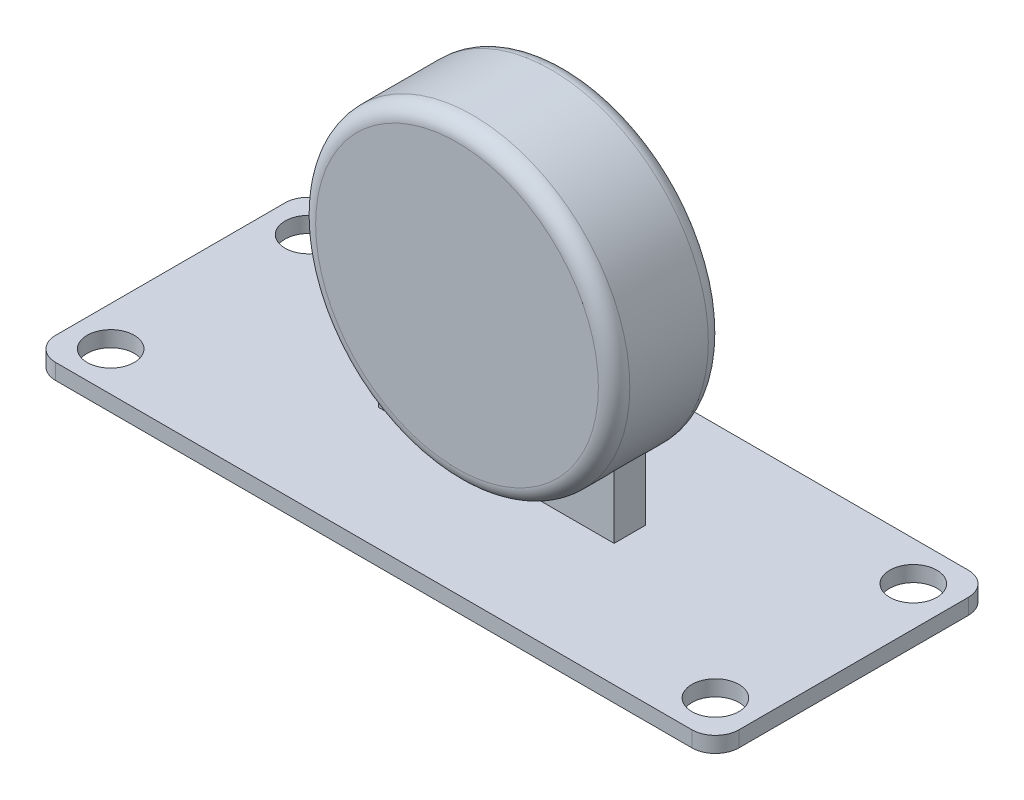
ISO-10303-21;
HEADER;
FILE_DESCRIPTION(('STEP AP214'),'2;1');
FILE_NAME('part.step','',(''),(''),'','','');
FILE_SCHEMA(('AUTOMOTIVE_DESIGN { 1 0 10303 214 1 1 1 1 }'));
ENDSEC;
DATA;
#1=APPLICATION_CONTEXT('core data for automotive mechanical design processes');
#2=APPLICATION_PROTOCOL_DEFINITION('international standard','automotive_design',2000,#1);
#3=PRODUCT_CONTEXT('',#1,'mechanical');
#4=PRODUCT('Part','Part','',(#3));
#5=PRODUCT_RELATED_PRODUCT_CATEGORY('part','',(#4));
#6=PRODUCT_DEFINITION_FORMATION('','',#4);
#7=PRODUCT_DEFINITION_CONTEXT('part definition',#1,'design');
#8=PRODUCT_DEFINITION('design','',#6,#7);
#9=PRODUCT_DEFINITION_SHAPE('','',#8);
#10=(LENGTH_UNIT() NAMED_UNIT(*) SI_UNIT(.MILLI.,.METRE.));
#11=(NAMED_UNIT(*) PLANE_ANGLE_UNIT() SI_UNIT($,.RADIAN.));
#12=(NAMED_UNIT(*) SI_UNIT($,.STERADIAN.) SOLID_ANGLE_UNIT());
#13=UNCERTAINTY_MEASURE_WITH_UNIT(LENGTH_MEASURE(1.E-05),#10,'distance_accuracy_value','');
#14=(GEOMETRIC_REPRESENTATION_CONTEXT(3) GLOBAL_UNCERTAINTY_ASSIGNED_CONTEXT((#13)) GLOBAL_UNIT_ASSIGNED_CONTEXT((#10,
#11,#12)) REPRESENTATION_CONTEXT('',''));
#15=CARTESIAN_POINT('',(0.,0.,0.));
#16=DIRECTION('',(0.,0.,1.));
#17=DIRECTION('',(1.,0.,0.));
#18=AXIS2_PLACEMENT_3D('',#15,#16,#17);
#19=CARTESIAN_POINT('',(-514.35,25.4,185.42));
#20=DIRECTION('',(0.,-1.,0.));
#21=DIRECTION('',(0.,0.,-1.));
#22=AXIS2_PLACEMENT_3D('',#19,#20,#21);
#23=PLANE('',#22);
#24=CARTESIAN_POINT('',(-488.95,25.4,160.02));
#25=DIRECTION('',(0.,1.,0.));
#26=DIRECTION('',(0.,0.,1.));
#27=AXIS2_PLACEMENT_3D('',#24,#25,#26);
#28=CIRCLE('',#27,38.1);
#29=CARTESIAN_POINT('',(-488.95,25.4,198.12));
#30=VERTEX_POINT('',#29);
#31=EDGE_CURVE('E244',#30,#30,#28,.T.);
#32=ORIENTED_EDGE('',*,*,#31,.F.);
#33=EDGE_LOOP('',(#32));
#34=FACE_BOUND('',#33,.T.);
#35=CARTESIAN_POINT('',(488.95,25.4,160.02));
#36=DIRECTION('',(0.,1.,0.));
#37=DIRECTION('',(0.,0.,1.));
#38=AXIS2_PLACEMENT_3D('',#35,#36,#37);
#39=CIRCLE('',#38,38.1);
#40=CARTESIAN_POINT('',(488.95,25.4,198.12));
#41=VERTEX_POINT('',#40);
#42=EDGE_CURVE('E250',#41,#41,#39,.T.);
#43=ORIENTED_EDGE('',*,*,#42,.F.);
#44=EDGE_LOOP('',(#43));
#45=FACE_BOUND('',#44,.T.);
#46=CARTESIAN_POINT('',(488.95,25.4,-160.02));
#47=DIRECTION('',(0.,1.,0.));
#48=DIRECTION('',(0.,0.,1.));
#49=AXIS2_PLACEMENT_3D('',#46,#47,#48);
#50=CIRCLE('',#49,38.1000000000001);
#51=CARTESIAN_POINT('',(488.95,25.4,-121.92));
#52=VERTEX_POINT('',#51);
#53=EDGE_CURVE('E256',#52,#52,#50,.T.);
#54=ORIENTED_EDGE('',*,*,#53,.F.);
#55=EDGE_LOOP('',(#54));
#56=FACE_BOUND('',#55,.T.);
#57=CARTESIAN_POINT('',(-488.95,25.4,-160.02));
#58=DIRECTION('',(0.,1.,0.));
#59=DIRECTION('',(0.,0.,1.));
#60=AXIS2_PLACEMENT_3D('',#57,#58,#59);
#61=CIRCLE('',#60,38.1);
#62=CARTESIAN_POINT('',(-488.95,25.4,-121.92));
#63=VERTEX_POINT('',#62);
#64=EDGE_CURVE('E147',#63,#63,#61,.T.);
#65=ORIENTED_EDGE('',*,*,#64,.F.);
#66=EDGE_LOOP('',(#65));
#67=FACE_BOUND('',#66,.T.);
#68=CARTESIAN_POINT('',(-514.35,25.4,185.42));
#69=DIRECTION('',(0.,1.,0.));
#70=DIRECTION('',(0.,0.,-1.));
#71=AXIS2_PLACEMENT_3D('',#68,#69,#70);
#72=CIRCLE('',#71,38.1);
#73=CARTESIAN_POINT('',(-552.45,25.4,185.42));
#74=VERTEX_POINT('',#73);
#75=CARTESIAN_POINT('',(-514.35,25.4,223.52));
#76=VERTEX_POINT('',#75);
#77=EDGE_CURVE('E159',#74,#76,#72,.T.);
#78=ORIENTED_EDGE('',*,*,#77,.T.);
#79=DIRECTION('',(1.,0.,0.));
#80=VECTOR('',#79,1.);
#81=CARTESIAN_POINT('',(-514.35,25.4,223.52));
#82=LINE('',#81,#80);
#83=CARTESIAN_POINT('',(514.35,25.4,223.52));
#84=VERTEX_POINT('',#83);
#85=EDGE_CURVE('E100',#76,#84,#82,.T.);
#86=ORIENTED_EDGE('',*,*,#85,.T.);
#87=CARTESIAN_POINT('',(514.35,25.4,185.42));
#88=DIRECTION('',(0.,1.,0.));
#89=DIRECTION('',(0.,0.,-1.));
#90=AXIS2_PLACEMENT_3D('',#87,#88,#89);
#91=CIRCLE('',#90,38.1);
#92=CARTESIAN_POINT('',(552.45,25.4,185.42));
#93=VERTEX_POINT('',#92);
#94=EDGE_CURVE('E268',#84,#93,#91,.T.);
#95=ORIENTED_EDGE('',*,*,#94,.T.);
#96=DIRECTION('',(0.,0.,-1.));
#97=VECTOR('',#96,1.);
#98=CARTESIAN_POINT('',(552.45,25.4,185.42));
#99=LINE('',#98,#97);
#100=CARTESIAN_POINT('',(552.45,25.4,-185.42));
#101=VERTEX_POINT('',#100);
#102=EDGE_CURVE('E270',#93,#101,#99,.T.);
#103=ORIENTED_EDGE('',*,*,#102,.T.);
#104=CARTESIAN_POINT('',(514.35,25.4,-185.42));
#105=DIRECTION('',(0.,1.,0.));
#106=DIRECTION('',(0.,0.,-1.));
#107=AXIS2_PLACEMENT_3D('',#104,#105,#106);
#108=CIRCLE('',#107,38.1);
#109=CARTESIAN_POINT('',(514.35,25.4,-223.52));
#110=VERTEX_POINT('',#109);
#111=EDGE_CURVE('E122',#101,#110,#108,.T.);
#112=ORIENTED_EDGE('',*,*,#111,.T.);
#113=DIRECTION('',(-1.,0.,0.));
#114=VECTOR('',#113,1.);
#115=CARTESIAN_POINT('',(-514.35,25.4,-223.52));
#116=LINE('',#115,#114);
#117=CARTESIAN_POINT('',(-514.35,25.4,-223.52));
#118=VERTEX_POINT('',#117);
#119=EDGE_CURVE('E115',#110,#118,#116,.T.);
#120=ORIENTED_EDGE('',*,*,#119,.T.);
#121=CARTESIAN_POINT('',(-514.35,25.4,-185.42));
#122=DIRECTION('',(0.,1.,0.));
#123=DIRECTION('',(0.,0.,1.));
#124=AXIS2_PLACEMENT_3D('',#121,#122,#123);
#125=CIRCLE('',#124,38.1);
#126=CARTESIAN_POINT('',(-552.45,25.4,-185.42));
#127=VERTEX_POINT('',#126);
#128=EDGE_CURVE('E119',#118,#127,#125,.T.);
#129=ORIENTED_EDGE('',*,*,#128,.T.);
#130=DIRECTION('',(0.,0.,1.));
#131=VECTOR('',#130,1.);
#132=CARTESIAN_POINT('',(-552.45,25.4,185.42));
#133=LINE('',#132,#131);
#134=EDGE_CURVE('E58',#127,#74,#133,.T.);
#135=ORIENTED_EDGE('',*,*,#134,.T.);
#136=EDGE_LOOP('',(#78,#86,#95,#103,#112,#120,#129,#135));
#137=FACE_BOUND('',#136,.T.);
#138=DIRECTION('',(1.,0.,0.));
#139=VECTOR('',#138,1.);
#140=CARTESIAN_POINT('',(-190.5,25.4,-25.4));
#141=LINE('',#140,#139);
#142=CARTESIAN_POINT('',(-190.5,25.4,-25.4));
#143=VERTEX_POINT('',#142);
#144=CARTESIAN_POINT('',(190.5,25.4,-25.4));
#145=VERTEX_POINT('',#144);
#146=EDGE_CURVE('E230',#143,#145,#141,.T.);
#147=ORIENTED_EDGE('',*,*,#146,.T.);
#148=DIRECTION('',(0.,0.,1.));
#149=VECTOR('',#148,1.);
#150=CARTESIAN_POINT('',(190.5,25.4,-25.4));
#151=LINE('',#150,#149);
#152=CARTESIAN_POINT('',(190.5,25.4,25.4));
#153=VERTEX_POINT('',#152);
#154=EDGE_CURVE('E240',#145,#153,#151,.T.);
#155=ORIENTED_EDGE('',*,*,#154,.T.);
#156=DIRECTION('',(1.,0.,0.));
#157=VECTOR('',#156,1.);
#158=CARTESIAN_POINT('',(-190.5,25.4,25.4));
#159=LINE('',#158,#157);
#160=CARTESIAN_POINT('',(-190.5,25.4,25.4));
#161=VERTEX_POINT('',#160);
#162=EDGE_CURVE('E460',#161,#153,#159,.T.);
#163=ORIENTED_EDGE('',*,*,#162,.F.);
#164=DIRECTION('',(0.,0.,1.));
#165=VECTOR('',#164,1.);
#166=CARTESIAN_POINT('',(-190.5,25.4,-25.4));
#167=LINE('',#166,#165);
#168=EDGE_CURVE('E216',#143,#161,#167,.T.);
#169=ORIENTED_EDGE('',*,*,#168,.F.);
#170=EDGE_LOOP('',(#147,#155,#163,#169));
#171=FACE_BOUND('',#170,.T.);
#172=ADVANCED_FACE('F34',(#34,#45,#56,#67,#137,#171),#23,.F.);
#173=CARTESIAN_POINT('',(-514.35,0.,185.42));
#174=DIRECTION('',(0.,-1.,0.));
#175=DIRECTION('',(0.,0.,-1.));
#176=AXIS2_PLACEMENT_3D('',#173,#174,#175);
#177=PLANE('',#176);
#178=CARTESIAN_POINT('',(488.95,0.,160.02));
#179=DIRECTION('',(0.,1.,0.));
#180=DIRECTION('',(0.,0.,1.));
#181=AXIS2_PLACEMENT_3D('',#178,#179,#180);
#182=CIRCLE('',#181,38.1);
#183=CARTESIAN_POINT('',(488.95,0.,198.12));
#184=VERTEX_POINT('',#183);
#185=EDGE_CURVE('E247',#184,#184,#182,.T.);
#186=ORIENTED_EDGE('',*,*,#185,.T.);
#187=EDGE_LOOP('',(#186));
#188=FACE_BOUND('',#187,.T.);
#189=CARTESIAN_POINT('',(-488.95,0.,-160.02));
#190=DIRECTION('',(0.,1.,0.));
#191=DIRECTION('',(0.,0.,1.));
#192=AXIS2_PLACEMENT_3D('',#189,#190,#191);
#193=CIRCLE('',#192,38.1);
#194=CARTESIAN_POINT('',(-488.95,0.,-121.92));
#195=VERTEX_POINT('',#194);
#196=EDGE_CURVE('E259',#195,#195,#193,.T.);
#197=ORIENTED_EDGE('',*,*,#196,.T.);
#198=EDGE_LOOP('',(#197));
#199=FACE_BOUND('',#198,.T.);
#200=CARTESIAN_POINT('',(-514.35,0.,185.42));
#201=DIRECTION('',(0.,1.,0.));
#202=DIRECTION('',(0.,0.,-1.));
#203=AXIS2_PLACEMENT_3D('',#200,#201,#202);
#204=CIRCLE('',#203,38.1);
#205=CARTESIAN_POINT('',(-552.45,0.,185.42));
#206=VERTEX_POINT('',#205);
#207=CARTESIAN_POINT('',(-514.35,0.,223.52));
#208=VERTEX_POINT('',#207);
#209=EDGE_CURVE('E143',#206,#208,#204,.T.);
#210=ORIENTED_EDGE('',*,*,#209,.F.);
#211=DIRECTION('',(0.,0.,1.));
#212=VECTOR('',#211,1.);
#213=CARTESIAN_POINT('',(-552.45,0.,185.42));
#214=LINE('',#213,#212);
#215=CARTESIAN_POINT('',(-552.45,0.,-185.42));
#216=VERTEX_POINT('',#215);
#217=EDGE_CURVE('E91',#216,#206,#214,.T.);
#218=ORIENTED_EDGE('',*,*,#217,.F.);
#219=CARTESIAN_POINT('',(-514.35,0.,-185.42));
#220=DIRECTION('',(0.,1.,0.));
#221=DIRECTION('',(0.,0.,1.));
#222=AXIS2_PLACEMENT_3D('',#219,#220,#221);
#223=CIRCLE('',#222,38.1);
#224=CARTESIAN_POINT('',(-514.35,0.,-223.52));
#225=VERTEX_POINT('',#224);
#226=EDGE_CURVE('E156',#225,#216,#223,.T.);
#227=ORIENTED_EDGE('',*,*,#226,.F.);
#228=DIRECTION('',(-1.,0.,0.));
#229=VECTOR('',#228,1.);
#230=CARTESIAN_POINT('',(-514.35,0.,-223.52));
#231=LINE('',#230,#229);
#232=CARTESIAN_POINT('',(514.35,0.,-223.52));
#233=VERTEX_POINT('',#232);
#234=EDGE_CURVE('E131',#233,#225,#231,.T.);
#235=ORIENTED_EDGE('',*,*,#234,.F.);
#236=CARTESIAN_POINT('',(514.35,0.,-185.42));
#237=DIRECTION('',(0.,1.,0.));
#238=DIRECTION('',(0.,0.,-1.));
#239=AXIS2_PLACEMENT_3D('',#236,#237,#238);
#240=CIRCLE('',#239,38.1);
#241=CARTESIAN_POINT('',(552.45,0.,-185.42));
#242=VERTEX_POINT('',#241);
#243=EDGE_CURVE('E153',#242,#233,#240,.T.);
#244=ORIENTED_EDGE('',*,*,#243,.F.);
#245=DIRECTION('',(0.,0.,-1.));
#246=VECTOR('',#245,1.);
#247=CARTESIAN_POINT('',(552.45,0.,185.42));
#248=LINE('',#247,#246);
#249=CARTESIAN_POINT('',(552.45,0.,185.42));
#250=VERTEX_POINT('',#249);
#251=EDGE_CURVE('E151',#250,#242,#248,.T.);
#252=ORIENTED_EDGE('',*,*,#251,.F.);
#253=CARTESIAN_POINT('',(514.35,0.,185.42));
#254=DIRECTION('',(0.,1.,0.));
#255=DIRECTION('',(0.,0.,-1.));
#256=AXIS2_PLACEMENT_3D('',#253,#254,#255);
#257=CIRCLE('',#256,38.1);
#258=CARTESIAN_POINT('',(514.35,0.,223.52));
#259=VERTEX_POINT('',#258);
#260=EDGE_CURVE('E149',#259,#250,#257,.T.);
#261=ORIENTED_EDGE('',*,*,#260,.F.);
#262=DIRECTION('',(1.,0.,0.));
#263=VECTOR('',#262,1.);
#264=CARTESIAN_POINT('',(-514.35,0.,223.52));
#265=LINE('',#264,#263);
#266=EDGE_CURVE('E146',#208,#259,#265,.T.);
#267=ORIENTED_EDGE('',*,*,#266,.F.);
#268=EDGE_LOOP('',(#210,#218,#227,#235,#244,#252,#261,#267));
#269=FACE_BOUND('',#268,.T.);
#270=CARTESIAN_POINT('',(488.95,0.,-160.02));
#271=DIRECTION('',(0.,1.,0.));
#272=DIRECTION('',(0.,0.,1.));
#273=AXIS2_PLACEMENT_3D('',#270,#271,#272);
#274=CIRCLE('',#273,38.1000000000001);
#275=CARTESIAN_POINT('',(488.95,0.,-121.92));
#276=VERTEX_POINT('',#275);
#277=EDGE_CURVE('E253',#276,#276,#274,.T.);
#278=ORIENTED_EDGE('',*,*,#277,.T.);
#279=EDGE_LOOP('',(#278));
#280=FACE_BOUND('',#279,.T.);
#281=CARTESIAN_POINT('',(-488.95,0.,160.02));
#282=DIRECTION('',(0.,1.,0.));
#283=DIRECTION('',(0.,0.,1.));
#284=AXIS2_PLACEMENT_3D('',#281,#282,#283);
#285=CIRCLE('',#284,38.1);
#286=CARTESIAN_POINT('',(-488.95,0.,198.12));
#287=VERTEX_POINT('',#286);
#288=EDGE_CURVE('E225',#287,#287,#285,.T.);
#289=ORIENTED_EDGE('',*,*,#288,.T.);
#290=EDGE_LOOP('',(#289));
#291=FACE_BOUND('',#290,.T.);
#292=ADVANCED_FACE('F283',(#188,#199,#269,#280,#291),#177,.T.);
#293=CARTESIAN_POINT('',(-514.35,25.4,185.42));
#294=DIRECTION('',(0.,-1.,0.));
#295=DIRECTION('',(0.,0.,-1.));
#296=AXIS2_PLACEMENT_3D('',#293,#294,#295);
#297=CYLINDRICAL_SURFACE('',#296,38.1);
#298=ORIENTED_EDGE('',*,*,#209,.T.);
#299=DIRECTION('',(0.,-1.,0.));
#300=VECTOR('',#299,1.);
#301=CARTESIAN_POINT('',(-514.35,25.4,223.52));
#302=LINE('',#301,#300);
#303=EDGE_CURVE('E172',#76,#208,#302,.T.);
#304=ORIENTED_EDGE('',*,*,#303,.F.);
#305=ORIENTED_EDGE('',*,*,#77,.F.);
#306=DIRECTION('',(0.,-1.,0.));
#307=VECTOR('',#306,1.);
#308=CARTESIAN_POINT('',(-552.45,25.4,185.42));
#309=LINE('',#308,#307);
#310=EDGE_CURVE('E139',#74,#206,#309,.T.);
#311=ORIENTED_EDGE('',*,*,#310,.T.);
#312=EDGE_LOOP('',(#298,#304,#305,#311));
#313=FACE_BOUND('',#312,.T.);
#314=ADVANCED_FACE('F289',(#313),#297,.T.);
#315=CARTESIAN_POINT('',(-514.35,25.4,223.52));
#316=DIRECTION('',(0.,0.,-1.));
#317=DIRECTION('',(-1.,0.,0.));
#318=AXIS2_PLACEMENT_3D('',#315,#316,#317);
#319=PLANE('',#318);
#320=ORIENTED_EDGE('',*,*,#266,.T.);
#321=DIRECTION('',(0.,-1.,0.));
#322=VECTOR('',#321,1.);
#323=CARTESIAN_POINT('',(514.35,25.4,223.52));
#324=LINE('',#323,#322);
#325=EDGE_CURVE('E169',#84,#259,#324,.T.);
#326=ORIENTED_EDGE('',*,*,#325,.F.);
#327=ORIENTED_EDGE('',*,*,#85,.F.);
#328=ORIENTED_EDGE('',*,*,#303,.T.);
#329=EDGE_LOOP('',(#320,#326,#327,#328));
#330=FACE_BOUND('',#329,.T.);
#331=ADVANCED_FACE('F290',(#330),#319,.F.);
#332=CARTESIAN_POINT('',(514.35,25.4,185.42));
#333=DIRECTION('',(0.,-1.,0.));
#334=DIRECTION('',(0.,0.,-1.));
#335=AXIS2_PLACEMENT_3D('',#332,#333,#334);
#336=CYLINDRICAL_SURFACE('',#335,38.1);
#337=ORIENTED_EDGE('',*,*,#260,.T.);
#338=DIRECTION('',(0.,-1.,0.));
#339=VECTOR('',#338,1.);
#340=CARTESIAN_POINT('',(552.45,25.4,185.42));
#341=LINE('',#340,#339);
#342=EDGE_CURVE('E166',#93,#250,#341,.T.);
#343=ORIENTED_EDGE('',*,*,#342,.F.);
#344=ORIENTED_EDGE('',*,*,#94,.F.);
#345=ORIENTED_EDGE('',*,*,#325,.T.);
#346=EDGE_LOOP('',(#337,#343,#344,#345));
#347=FACE_BOUND('',#346,.T.);
#348=ADVANCED_FACE('F293',(#347),#336,.T.);
#349=CARTESIAN_POINT('',(552.45,25.4,185.42));
#350=DIRECTION('',(-1.,0.,0.));
#351=DIRECTION('',(0.,0.,1.));
#352=AXIS2_PLACEMENT_3D('',#349,#350,#351);
#353=PLANE('',#352);
#354=ORIENTED_EDGE('',*,*,#251,.T.);
#355=DIRECTION('',(0.,-1.,0.));
#356=VECTOR('',#355,1.);
#357=CARTESIAN_POINT('',(552.45,25.4,-185.42));
#358=LINE('',#357,#356);
#359=EDGE_CURVE('E163',#101,#242,#358,.T.);
#360=ORIENTED_EDGE('',*,*,#359,.F.);
#361=ORIENTED_EDGE('',*,*,#102,.F.);
#362=ORIENTED_EDGE('',*,*,#342,.T.);
#363=EDGE_LOOP('',(#354,#360,#361,#362));
#364=FACE_BOUND('',#363,.T.);
#365=ADVANCED_FACE('F276',(#364),#353,.F.);
#366=CARTESIAN_POINT('',(514.35,25.4,-185.42));
#367=DIRECTION('',(0.,-1.,0.));
#368=DIRECTION('',(0.,0.,-1.));
#369=AXIS2_PLACEMENT_3D('',#366,#367,#368);
#370=CYLINDRICAL_SURFACE('',#369,38.1);
#371=ORIENTED_EDGE('',*,*,#243,.T.);
#372=DIRECTION('',(0.,-1.,0.));
#373=VECTOR('',#372,1.);
#374=CARTESIAN_POINT('',(514.35,25.4,-223.52));
#375=LINE('',#374,#373);
#376=EDGE_CURVE('E134',#110,#233,#375,.T.);
#377=ORIENTED_EDGE('',*,*,#376,.F.);
#378=ORIENTED_EDGE('',*,*,#111,.F.);
#379=ORIENTED_EDGE('',*,*,#359,.T.);
#380=EDGE_LOOP('',(#371,#377,#378,#379));
#381=FACE_BOUND('',#380,.T.);
#382=ADVANCED_FACE('F280',(#381),#370,.T.);
#383=CARTESIAN_POINT('',(-514.35,25.4,-223.52));
#384=DIRECTION('',(0.,0.,1.));
#385=DIRECTION('',(1.,0.,0.));
#386=AXIS2_PLACEMENT_3D('',#383,#384,#385);
#387=PLANE('',#386);
#388=ORIENTED_EDGE('',*,*,#234,.T.);
#389=DIRECTION('',(0.,-1.,0.));
#390=VECTOR('',#389,1.);
#391=CARTESIAN_POINT('',(-514.35,25.4,-223.52));
#392=LINE('',#391,#390);
#393=EDGE_CURVE('E128',#118,#225,#392,.T.);
#394=ORIENTED_EDGE('',*,*,#393,.F.);
#395=ORIENTED_EDGE('',*,*,#119,.F.);
#396=ORIENTED_EDGE('',*,*,#376,.T.);
#397=EDGE_LOOP('',(#388,#394,#395,#396));
#398=FACE_BOUND('',#397,.T.);
#399=ADVANCED_FACE('F129',(#398),#387,.F.);
#400=CARTESIAN_POINT('',(-514.35,25.4,-185.42));
#401=DIRECTION('',(0.,-1.,0.));
#402=DIRECTION('',(0.,0.,-1.));
#403=AXIS2_PLACEMENT_3D('',#400,#401,#402);
#404=CYLINDRICAL_SURFACE('',#403,38.1);
#405=ORIENTED_EDGE('',*,*,#226,.T.);
#406=DIRECTION('',(0.,-1.,0.));
#407=VECTOR('',#406,1.);
#408=CARTESIAN_POINT('',(-552.45,25.4,-185.42));
#409=LINE('',#408,#407);
#410=EDGE_CURVE('E135',#127,#216,#409,.T.);
#411=ORIENTED_EDGE('',*,*,#410,.F.);
#412=ORIENTED_EDGE('',*,*,#128,.F.);
#413=ORIENTED_EDGE('',*,*,#393,.T.);
#414=EDGE_LOOP('',(#405,#411,#412,#413));
#415=FACE_BOUND('',#414,.T.);
#416=ADVANCED_FACE('F137',(#415),#404,.T.);
#417=CARTESIAN_POINT('',(-552.45,25.4,185.42));
#418=DIRECTION('',(1.,0.,0.));
#419=DIRECTION('',(0.,0.,-1.));
#420=AXIS2_PLACEMENT_3D('',#417,#418,#419);
#421=PLANE('',#420);
#422=ORIENTED_EDGE('',*,*,#217,.T.);
#423=ORIENTED_EDGE('',*,*,#310,.F.);
#424=ORIENTED_EDGE('',*,*,#134,.F.);
#425=ORIENTED_EDGE('',*,*,#410,.T.);
#426=EDGE_LOOP('',(#422,#423,#424,#425));
#427=FACE_BOUND('',#426,.T.);
#428=ADVANCED_FACE('F285',(#427),#421,.F.);
#429=CARTESIAN_POINT('',(-488.95,25.4,-160.02));
#430=DIRECTION('',(0.,-1.,0.));
#431=DIRECTION('',(0.,0.,-1.));
#432=AXIS2_PLACEMENT_3D('',#429,#430,#431);
#433=CYLINDRICAL_SURFACE('',#432,38.1);
#434=ORIENTED_EDGE('',*,*,#64,.T.);
#435=EDGE_LOOP('',(#434));
#436=FACE_BOUND('',#435,.T.);
#437=ORIENTED_EDGE('',*,*,#196,.F.);
#438=EDGE_LOOP('',(#437));
#439=FACE_BOUND('',#438,.T.);
#440=ADVANCED_FACE('F315',(#436,#439),#433,.F.);
#441=CARTESIAN_POINT('',(488.95,25.4,-160.02));
#442=DIRECTION('',(0.,-1.,0.));
#443=DIRECTION('',(0.,0.,-1.));
#444=AXIS2_PLACEMENT_3D('',#441,#442,#443);
#445=CYLINDRICAL_SURFACE('',#444,38.1000000000001);
#446=ORIENTED_EDGE('',*,*,#53,.T.);
#447=EDGE_LOOP('',(#446));
#448=FACE_BOUND('',#447,.T.);
#449=ORIENTED_EDGE('',*,*,#277,.F.);
#450=EDGE_LOOP('',(#449));
#451=FACE_BOUND('',#450,.T.);
#452=ADVANCED_FACE('F348',(#448,#451),#445,.F.);
#453=CARTESIAN_POINT('',(488.95,25.4,160.02));
#454=DIRECTION('',(0.,-1.,0.));
#455=DIRECTION('',(0.,0.,-1.));
#456=AXIS2_PLACEMENT_3D('',#453,#454,#455);
#457=CYLINDRICAL_SURFACE('',#456,38.1);
#458=ORIENTED_EDGE('',*,*,#42,.T.);
#459=EDGE_LOOP('',(#458));
#460=FACE_BOUND('',#459,.T.);
#461=ORIENTED_EDGE('',*,*,#185,.F.);
#462=EDGE_LOOP('',(#461));
#463=FACE_BOUND('',#462,.T.);
#464=ADVANCED_FACE('F355',(#460,#463),#457,.F.);
#465=CARTESIAN_POINT('',(-488.95,25.4,160.02));
#466=DIRECTION('',(0.,-1.,0.));
#467=DIRECTION('',(0.,0.,-1.));
#468=AXIS2_PLACEMENT_3D('',#465,#466,#467);
#469=CYLINDRICAL_SURFACE('',#468,38.1);
#470=ORIENTED_EDGE('',*,*,#31,.T.);
#471=EDGE_LOOP('',(#470));
#472=FACE_BOUND('',#471,.T.);
#473=ORIENTED_EDGE('',*,*,#288,.F.);
#474=EDGE_LOOP('',(#473));
#475=FACE_BOUND('',#474,.T.);
#476=ADVANCED_FACE('F362',(#472,#475),#469,.F.);
#477=CARTESIAN_POINT('',(-190.5,25.4,-25.4));
#478=DIRECTION('',(-1.,0.,0.));
#479=DIRECTION('',(0.,0.,1.));
#480=AXIS2_PLACEMENT_3D('',#477,#478,#479);
#481=PLANE('',#480);
#482=ORIENTED_EDGE('',*,*,#168,.T.);
#483=DIRECTION('',(0.,-1.,0.));
#484=VECTOR('',#483,1.);
#485=CARTESIAN_POINT('',(-190.5,25.4,25.4));
#486=LINE('',#485,#484);
#487=CARTESIAN_POINT('',(-190.5,127.,25.4));
#488=VERTEX_POINT('',#487);
#489=EDGE_CURVE('E49',#488,#161,#486,.T.);
#490=ORIENTED_EDGE('',*,*,#489,.F.);
#491=DIRECTION('',(0.,0.,1.));
#492=VECTOR('',#491,1.);
#493=CARTESIAN_POINT('',(-190.5,127.,-25.4));
#494=LINE('',#493,#492);
#495=CARTESIAN_POINT('',(-190.5,127.,-25.4));
#496=VERTEX_POINT('',#495);
#497=EDGE_CURVE('E206',#496,#488,#494,.T.);
#498=ORIENTED_EDGE('',*,*,#497,.F.);
#499=DIRECTION('',(0.,-1.,0.));
#500=VECTOR('',#499,1.);
#501=CARTESIAN_POINT('',(-190.5,25.4,-25.4));
#502=LINE('',#501,#500);
#503=EDGE_CURVE('E223',#496,#143,#502,.T.);
#504=ORIENTED_EDGE('',*,*,#503,.T.);
#505=EDGE_LOOP('',(#482,#490,#498,#504));
#506=FACE_BOUND('',#505,.T.);
#507=ADVANCED_FACE('F221',(#506),#481,.T.);
#508=CARTESIAN_POINT('',(190.5,25.4,-25.4));
#509=DIRECTION('',(1.,0.,0.));
#510=DIRECTION('',(0.,0.,-1.));
#511=AXIS2_PLACEMENT_3D('',#508,#509,#510);
#512=PLANE('',#511);
#513=DIRECTION('',(0.,0.,1.));
#514=VECTOR('',#513,1.);
#515=CARTESIAN_POINT('',(190.5,127.,-25.4));
#516=LINE('',#515,#514);
#517=CARTESIAN_POINT('',(190.5,127.,-25.4));
#518=VERTEX_POINT('',#517);
#519=CARTESIAN_POINT('',(190.5,127.,25.4));
#520=VERTEX_POINT('',#519);
#521=EDGE_CURVE('E209',#518,#520,#516,.T.);
#522=ORIENTED_EDGE('',*,*,#521,.T.);
#523=DIRECTION('',(0.,1.,0.));
#524=VECTOR('',#523,1.);
#525=CARTESIAN_POINT('',(190.5,25.4,25.4));
#526=LINE('',#525,#524);
#527=EDGE_CURVE('E234',#153,#520,#526,.T.);
#528=ORIENTED_EDGE('',*,*,#527,.F.);
#529=ORIENTED_EDGE('',*,*,#154,.F.);
#530=DIRECTION('',(0.,1.,0.));
#531=VECTOR('',#530,1.);
#532=CARTESIAN_POINT('',(190.5,25.4,-25.4));
#533=LINE('',#532,#531);
#534=EDGE_CURVE('E217',#145,#518,#533,.T.);
#535=ORIENTED_EDGE('',*,*,#534,.T.);
#536=EDGE_LOOP('',(#522,#528,#529,#535));
#537=FACE_BOUND('',#536,.T.);
#538=ADVANCED_FACE('F381',(#537),#512,.T.);
#539=CARTESIAN_POINT('',(0.,295.005208252601,-25.4));
#540=DIRECTION('',(0.,0.,1.));
#541=DIRECTION('',(1.,0.,0.));
#542=AXIS2_PLACEMENT_3D('',#539,#540,#541);
#543=PLANE('',#542);
#544=ORIENTED_EDGE('',*,*,#503,.F.);
#545=CARTESIAN_POINT('',(0.,295.005208252601,-25.4));
#546=DIRECTION('',(0.,0.,-1.));
#547=DIRECTION('',(1.,0.,0.));
#548=AXIS2_PLACEMENT_3D('',#545,#546,#547);
#549=CIRCLE('',#548,254.);
#550=EDGE_CURVE('E202',#518,#496,#549,.T.);
#551=ORIENTED_EDGE('',*,*,#550,.F.);
#552=ORIENTED_EDGE('',*,*,#534,.F.);
#553=ORIENTED_EDGE('',*,*,#146,.F.);
#554=EDGE_LOOP('',(#544,#551,#552,#553));
#555=FACE_BOUND('',#554,.T.);
#556=ADVANCED_FACE('F228',(#555),#543,.F.);
#557=CARTESIAN_POINT('',(0.,295.005208252601,25.4));
#558=DIRECTION('',(0.,0.,1.));
#559=DIRECTION('',(1.,0.,0.));
#560=AXIS2_PLACEMENT_3D('',#557,#558,#559);
#561=PLANE('',#560);
#562=ORIENTED_EDGE('',*,*,#489,.T.);
#563=ORIENTED_EDGE('',*,*,#162,.T.);
#564=ORIENTED_EDGE('',*,*,#527,.T.);
#565=CARTESIAN_POINT('',(0.,295.005208252601,25.4));
#566=DIRECTION('',(0.,0.,-1.));
#567=DIRECTION('',(1.,0.,0.));
#568=AXIS2_PLACEMENT_3D('',#565,#566,#567);
#569=CIRCLE('',#568,254.);
#570=EDGE_CURVE('E231',#520,#488,#569,.T.);
#571=ORIENTED_EDGE('',*,*,#570,.T.);
#572=EDGE_LOOP('',(#562,#563,#564,#571));
#573=FACE_BOUND('',#572,.T.);
#574=ADVANCED_FACE('F193',(#573),#561,.T.);
#575=CARTESIAN_POINT('',(0.,295.005208252601,-88.9));
#576=DIRECTION('',(0.,0.,1.));
#577=DIRECTION('',(1.,0.,0.));
#578=AXIS2_PLACEMENT_3D('',#575,#576,#577);
#579=CYLINDRICAL_SURFACE('',#578,254.);
#580=CARTESIAN_POINT('',(0.,295.005208252601,-63.5));
#581=DIRECTION('',(0.,0.,1.));
#582=DIRECTION('',(1.,0.,0.));
#583=AXIS2_PLACEMENT_3D('',#580,#581,#582);
#584=CIRCLE('',#583,254.);
#585=CARTESIAN_POINT('',(254.,295.005208252601,-63.5));
#586=VERTEX_POINT('',#585);
#587=EDGE_CURVE('E177',#586,#586,#584,.T.);
#588=ORIENTED_EDGE('',*,*,#587,.T.);
#589=EDGE_LOOP('',(#588));
#590=FACE_BOUND('',#589,.T.);
#591=CARTESIAN_POINT('',(0.,295.005208252601,63.5));
#592=DIRECTION('',(0.,0.,1.));
#593=DIRECTION('',(1.,0.,0.));
#594=AXIS2_PLACEMENT_3D('',#591,#592,#593);
#595=CIRCLE('',#594,254.);
#596=CARTESIAN_POINT('',(254.,295.005208252601,63.5));
#597=VERTEX_POINT('',#596);
#598=EDGE_CURVE('E174',#597,#597,#595,.F.);
#599=ORIENTED_EDGE('',*,*,#598,.T.);
#600=EDGE_LOOP('',(#599));
#601=FACE_BOUND('',#600,.T.);
#602=ORIENTED_EDGE('',*,*,#550,.T.);
#603=ORIENTED_EDGE('',*,*,#497,.T.);
#604=ORIENTED_EDGE('',*,*,#570,.F.);
#605=ORIENTED_EDGE('',*,*,#521,.F.);
#606=EDGE_LOOP('',(#602,#603,#604,#605));
#607=FACE_BOUND('',#606,.T.);
#608=ADVANCED_FACE('F190',(#590,#601,#607),#579,.T.);
#609=CARTESIAN_POINT('',(0.,295.005208252601,-88.9));
#610=DIRECTION('',(0.,0.,1.));
#611=DIRECTION('',(1.,0.,0.));
#612=AXIS2_PLACEMENT_3D('',#609,#610,#611);
#613=PLANE('',#612);
#614=CARTESIAN_POINT('',(0.,295.005208252601,-88.9));
#615=DIRECTION('',(0.,0.,1.));
#616=DIRECTION('',(1.,0.,0.));
#617=AXIS2_PLACEMENT_3D('',#614,#615,#616);
#618=CIRCLE('',#617,228.6);
#619=CARTESIAN_POINT('',(228.6,295.005208252601,-88.9));
#620=VERTEX_POINT('',#619);
#621=EDGE_CURVE('E42',#620,#620,#618,.F.);
#622=ORIENTED_EDGE('',*,*,#621,.T.);
#623=EDGE_LOOP('',(#622));
#624=FACE_BOUND('',#623,.T.);
#625=ADVANCED_FACE('F182',(#624),#613,.F.);
#626=CARTESIAN_POINT('',(0.,295.005208252601,88.9));
#627=DIRECTION('',(0.,0.,1.));
#628=DIRECTION('',(1.,0.,0.));
#629=AXIS2_PLACEMENT_3D('',#626,#627,#628);
#630=PLANE('',#629);
#631=CARTESIAN_POINT('',(0.,295.005208252601,88.9));
#632=DIRECTION('',(0.,0.,1.));
#633=DIRECTION('',(1.,0.,0.));
#634=AXIS2_PLACEMENT_3D('',#631,#632,#633);
#635=CIRCLE('',#634,228.6);
#636=CARTESIAN_POINT('',(228.6,295.005208252601,88.9));
#637=VERTEX_POINT('',#636);
#638=EDGE_CURVE('E11',#637,#637,#635,.T.);
#639=ORIENTED_EDGE('',*,*,#638,.T.);
#640=EDGE_LOOP('',(#639));
#641=FACE_BOUND('',#640,.T.);
#642=ADVANCED_FACE('F187',(#641),#630,.T.);
#643=CARTESIAN_POINT('',(0.,295.005208252601,-63.5));
#644=DIRECTION('',(0.,0.,1.));
#645=DIRECTION('',(1.,0.,0.));
#646=AXIS2_PLACEMENT_3D('',#643,#644,#645);
#647=TOROIDAL_SURFACE('',#646,228.6,25.4);
#648=ORIENTED_EDGE('',*,*,#621,.F.);
#649=EDGE_LOOP('',(#648));
#650=FACE_BOUND('',#649,.T.);
#651=ORIENTED_EDGE('',*,*,#587,.F.);
#652=EDGE_LOOP('',(#651));
#653=FACE_BOUND('',#652,.T.);
#654=ADVANCED_FACE('F184',(#650,#653),#647,.T.);
#655=CARTESIAN_POINT('',(0.,295.005208252601,63.5));
#656=DIRECTION('',(0.,0.,1.));
#657=DIRECTION('',(1.,0.,0.));
#658=AXIS2_PLACEMENT_3D('',#655,#656,#657);
#659=TOROIDAL_SURFACE('',#658,228.6,25.4);
#660=ORIENTED_EDGE('',*,*,#598,.F.);
#661=EDGE_LOOP('',(#660));
#662=FACE_BOUND('',#661,.T.);
#663=ORIENTED_EDGE('',*,*,#638,.F.);
#664=EDGE_LOOP('',(#663));
#665=FACE_BOUND('',#664,.T.);
#666=ADVANCED_FACE('F36',(#662,#665),#659,.T.);
#667=CLOSED_SHELL('',(#172,#292,#314,#331,#348,#365,#382,#399,#416,#428,#440,#452,#464,#476,
#507,#538,#556,#574,#608,#625,#642,#654,#666));
#668=MANIFOLD_SOLID_BREP('B2',#667);
#669=ADVANCED_BREP_SHAPE_REPRESENTATION('',(#18,#668),#14);
#670=SHAPE_DEFINITION_REPRESENTATION(#9,#669);
ENDSEC;
END-ISO-10303-21;
